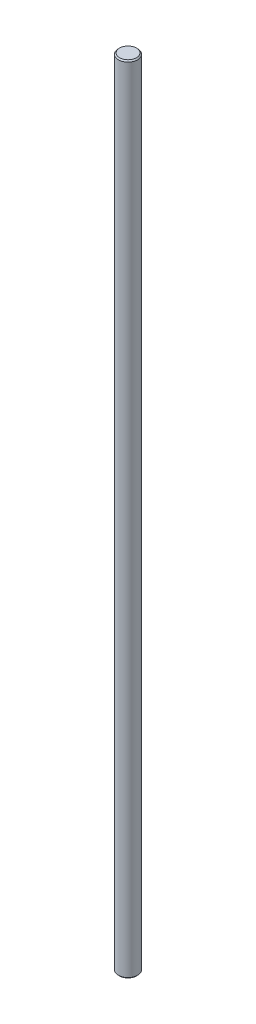
ISO-10303-21;
HEADER;
FILE_DESCRIPTION(('STEP AP214'),'2;1');
FILE_NAME('part.step','',(''),(''),'','','');
FILE_SCHEMA(('AUTOMOTIVE_DESIGN { 1 0 10303 214 1 1 1 1 }'));
ENDSEC;
DATA;
#1=APPLICATION_CONTEXT('core data for automotive mechanical design processes');
#2=APPLICATION_PROTOCOL_DEFINITION('international standard','automotive_design',2000,#1);
#3=PRODUCT_CONTEXT('',#1,'mechanical');
#4=PRODUCT('Part','Part','',(#3));
#5=PRODUCT_RELATED_PRODUCT_CATEGORY('part','',(#4));
#6=PRODUCT_DEFINITION_FORMATION('','',#4);
#7=PRODUCT_DEFINITION_CONTEXT('part definition',#1,'design');
#8=PRODUCT_DEFINITION('design','',#6,#7);
#9=PRODUCT_DEFINITION_SHAPE('','',#8);
#10=(LENGTH_UNIT() NAMED_UNIT(*) SI_UNIT(.MILLI.,.METRE.));
#11=(NAMED_UNIT(*) PLANE_ANGLE_UNIT() SI_UNIT($,.RADIAN.));
#12=(NAMED_UNIT(*) SI_UNIT($,.STERADIAN.) SOLID_ANGLE_UNIT());
#13=UNCERTAINTY_MEASURE_WITH_UNIT(LENGTH_MEASURE(1.E-05),#10,'distance_accuracy_value','');
#14=(GEOMETRIC_REPRESENTATION_CONTEXT(3) GLOBAL_UNCERTAINTY_ASSIGNED_CONTEXT((#13)) GLOBAL_UNIT_ASSIGNED_CONTEXT((#10,
#11,#12)) REPRESENTATION_CONTEXT('',''));
#15=CARTESIAN_POINT('',(0.,0.,0.));
#16=DIRECTION('',(0.,0.,1.));
#17=DIRECTION('',(1.,0.,0.));
#18=AXIS2_PLACEMENT_3D('',#15,#16,#17);
#19=CARTESIAN_POINT('',(0.,329.5,0.));
#20=DIRECTION('',(0.,-1.,0.));
#21=DIRECTION('',(0.,0.,-1.));
#22=AXIS2_PLACEMENT_3D('',#19,#20,#21);
#23=CONICAL_SURFACE('',#22,4.,0.785398163397448);
#24=CARTESIAN_POINT('',(0.,330.,0.));
#25=DIRECTION('',(0.,-1.,0.));
#26=DIRECTION('',(0.,0.,-1.));
#27=AXIS2_PLACEMENT_3D('',#24,#25,#26);
#28=CIRCLE('',#27,3.5);
#29=CARTESIAN_POINT('',(0.,330.,-3.5));
#30=VERTEX_POINT('',#29);
#31=EDGE_CURVE('E42',#30,#30,#28,.T.);
#32=ORIENTED_EDGE('',*,*,#31,.T.);
#33=EDGE_LOOP('',(#32));
#34=FACE_BOUND('',#33,.T.);
#35=CARTESIAN_POINT('',(0.,329.5,0.));
#36=DIRECTION('',(0.,-1.,0.));
#37=DIRECTION('',(0.,0.,-1.));
#38=AXIS2_PLACEMENT_3D('',#35,#36,#37);
#39=CIRCLE('',#38,4.);
#40=CARTESIAN_POINT('',(0.,329.5,-4.));
#41=VERTEX_POINT('',#40);
#42=EDGE_CURVE('E10',#41,#41,#39,.T.);
#43=ORIENTED_EDGE('',*,*,#42,.F.);
#44=EDGE_LOOP('',(#43));
#45=FACE_BOUND('',#44,.T.);
#46=ADVANCED_FACE('F28',(#34,#45),#23,.T.);
#47=CARTESIAN_POINT('',(0.,330.,0.));
#48=DIRECTION('',(0.,-1.,0.));
#49=DIRECTION('',(0.,0.,-1.));
#50=AXIS2_PLACEMENT_3D('',#47,#48,#49);
#51=CYLINDRICAL_SURFACE('',#50,4.);
#52=ORIENTED_EDGE('',*,*,#42,.T.);
#53=EDGE_LOOP('',(#52));
#54=FACE_BOUND('',#53,.T.);
#55=CARTESIAN_POINT('',(0.,0.5,0.));
#56=DIRECTION('',(0.,-1.,0.));
#57=DIRECTION('',(0.,0.,-1.));
#58=AXIS2_PLACEMENT_3D('',#55,#56,#57);
#59=CIRCLE('',#58,4.);
#60=CARTESIAN_POINT('',(0.,0.5,-4.));
#61=VERTEX_POINT('',#60);
#62=EDGE_CURVE('E34',#61,#61,#59,.T.);
#63=ORIENTED_EDGE('',*,*,#62,.F.);
#64=EDGE_LOOP('',(#63));
#65=FACE_BOUND('',#64,.T.);
#66=ADVANCED_FACE('F61',(#54,#65),#51,.T.);
#67=CARTESIAN_POINT('',(0.,0.,0.));
#68=DIRECTION('',(0.,1.,0.));
#69=DIRECTION('',(0.,0.,1.));
#70=AXIS2_PLACEMENT_3D('',#67,#68,#69);
#71=CONICAL_SURFACE('',#70,3.5,0.785398163397448);
#72=ORIENTED_EDGE('',*,*,#62,.T.);
#73=EDGE_LOOP('',(#72));
#74=FACE_BOUND('',#73,.T.);
#75=CARTESIAN_POINT('',(0.,0.,0.));
#76=DIRECTION('',(0.,-1.,0.));
#77=DIRECTION('',(0.,0.,-1.));
#78=AXIS2_PLACEMENT_3D('',#75,#76,#77);
#79=CIRCLE('',#78,3.5);
#80=CARTESIAN_POINT('',(0.,0.,-3.5));
#81=VERTEX_POINT('',#80);
#82=EDGE_CURVE('E38',#81,#81,#79,.T.);
#83=ORIENTED_EDGE('',*,*,#82,.F.);
#84=EDGE_LOOP('',(#83));
#85=FACE_BOUND('',#84,.T.);
#86=ADVANCED_FACE('F57',(#74,#85),#71,.T.);
#87=CARTESIAN_POINT('',(0.,0.,0.));
#88=DIRECTION('',(0.,-1.,0.));
#89=DIRECTION('',(0.,0.,-1.));
#90=AXIS2_PLACEMENT_3D('',#87,#88,#89);
#91=PLANE('',#90);
#92=ORIENTED_EDGE('',*,*,#82,.T.);
#93=EDGE_LOOP('',(#92));
#94=FACE_BOUND('',#93,.T.);
#95=ADVANCED_FACE('F52',(#94),#91,.T.);
#96=CARTESIAN_POINT('',(3.5,330.,0.));
#97=DIRECTION('',(0.,1.,0.));
#98=DIRECTION('',(0.,0.,1.));
#99=AXIS2_PLACEMENT_3D('',#96,#97,#98);
#100=PLANE('',#99);
#101=ORIENTED_EDGE('',*,*,#31,.F.);
#102=EDGE_LOOP('',(#101));
#103=FACE_BOUND('',#102,.T.);
#104=ADVANCED_FACE('F50',(#103),#100,.T.);
#105=CLOSED_SHELL('',(#46,#66,#86,#95,#104));
#106=MANIFOLD_SOLID_BREP('B2',#105);
#107=ADVANCED_BREP_SHAPE_REPRESENTATION('',(#18,#106),#14);
#108=SHAPE_DEFINITION_REPRESENTATION(#9,#107);
ENDSEC;
END-ISO-10303-21;
